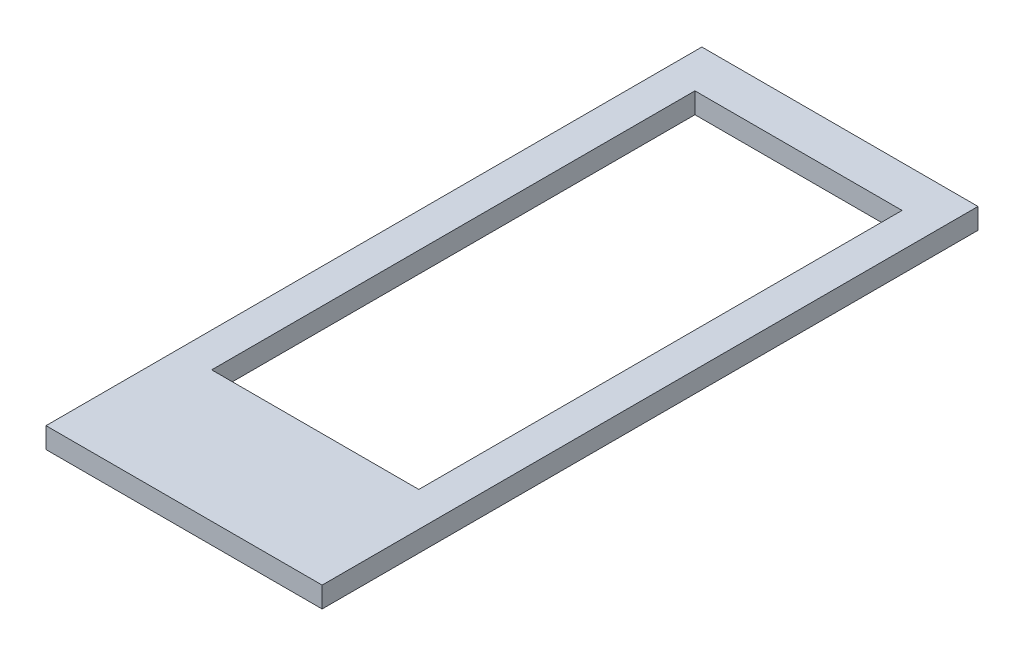
ISO-10303-21;
HEADER;
FILE_DESCRIPTION(('STEP AP214'),'2;1');
FILE_NAME('part.step','',(''),(''),'','','');
FILE_SCHEMA(('AUTOMOTIVE_DESIGN { 1 0 10303 214 1 1 1 1 }'));
ENDSEC;
DATA;
#1=APPLICATION_CONTEXT('core data for automotive mechanical design processes');
#2=APPLICATION_PROTOCOL_DEFINITION('international standard','automotive_design',2000,#1);
#3=PRODUCT_CONTEXT('',#1,'mechanical');
#4=PRODUCT('Part','Part','',(#3));
#5=PRODUCT_RELATED_PRODUCT_CATEGORY('part','',(#4));
#6=PRODUCT_DEFINITION_FORMATION('','',#4);
#7=PRODUCT_DEFINITION_CONTEXT('part definition',#1,'design');
#8=PRODUCT_DEFINITION('design','',#6,#7);
#9=PRODUCT_DEFINITION_SHAPE('','',#8);
#10=(LENGTH_UNIT() NAMED_UNIT(*) SI_UNIT(.MILLI.,.METRE.));
#11=(NAMED_UNIT(*) PLANE_ANGLE_UNIT() SI_UNIT($,.RADIAN.));
#12=(NAMED_UNIT(*) SI_UNIT($,.STERADIAN.) SOLID_ANGLE_UNIT());
#13=UNCERTAINTY_MEASURE_WITH_UNIT(LENGTH_MEASURE(1.E-05),#10,'distance_accuracy_value','');
#14=(GEOMETRIC_REPRESENTATION_CONTEXT(3) GLOBAL_UNCERTAINTY_ASSIGNED_CONTEXT((#13)) GLOBAL_UNIT_ASSIGNED_CONTEXT((#10,
#11,#12)) REPRESENTATION_CONTEXT('',''));
#15=CARTESIAN_POINT('',(0.,0.,0.));
#16=DIRECTION('',(0.,0.,1.));
#17=DIRECTION('',(1.,0.,0.));
#18=AXIS2_PLACEMENT_3D('',#15,#16,#17);
#19=CARTESIAN_POINT('',(0.,3.,0.));
#20=DIRECTION('',(0.,1.,0.));
#21=DIRECTION('',(0.,0.,1.));
#22=AXIS2_PLACEMENT_3D('',#19,#20,#21);
#23=PLANE('',#22);
#24=DIRECTION('',(0.,0.,-1.));
#25=VECTOR('',#24,1.);
#26=CARTESIAN_POINT('',(20.,3.,-47.5));
#27=LINE('',#26,#25);
#28=CARTESIAN_POINT('',(20.,3.,47.5));
#29=VERTEX_POINT('',#28);
#30=CARTESIAN_POINT('',(20.,3.,-47.5));
#31=VERTEX_POINT('',#30);
#32=EDGE_CURVE('E146',#29,#31,#27,.T.);
#33=ORIENTED_EDGE('',*,*,#32,.T.);
#34=DIRECTION('',(-1.,0.,0.));
#35=VECTOR('',#34,1.);
#36=CARTESIAN_POINT('',(-20.,3.,-47.5));
#37=LINE('',#36,#35);
#38=CARTESIAN_POINT('',(-20.,3.,-47.5));
#39=VERTEX_POINT('',#38);
#40=EDGE_CURVE('E149',#31,#39,#37,.T.);
#41=ORIENTED_EDGE('',*,*,#40,.T.);
#42=DIRECTION('',(0.,0.,1.));
#43=VECTOR('',#42,1.);
#44=CARTESIAN_POINT('',(-20.,3.,-47.5));
#45=LINE('',#44,#43);
#46=CARTESIAN_POINT('',(-20.,3.,47.5));
#47=VERTEX_POINT('',#46);
#48=EDGE_CURVE('E152',#39,#47,#45,.T.);
#49=ORIENTED_EDGE('',*,*,#48,.T.);
#50=DIRECTION('',(1.,0.,0.));
#51=VECTOR('',#50,1.);
#52=CARTESIAN_POINT('',(-20.,3.,47.5));
#53=LINE('',#52,#51);
#54=EDGE_CURVE('E154',#47,#29,#53,.T.);
#55=ORIENTED_EDGE('',*,*,#54,.T.);
#56=EDGE_LOOP('',(#33,#41,#49,#55));
#57=FACE_BOUND('',#56,.T.);
#58=DIRECTION('',(1.,0.,0.));
#59=VECTOR('',#58,1.);
#60=CARTESIAN_POINT('',(-15.,3.,28.5));
#61=LINE('',#60,#59);
#62=CARTESIAN_POINT('',(-15.,3.,28.5));
#63=VERTEX_POINT('',#62);
#64=CARTESIAN_POINT('',(15.,3.,28.5));
#65=VERTEX_POINT('',#64);
#66=EDGE_CURVE('E118',#63,#65,#61,.T.);
#67=ORIENTED_EDGE('',*,*,#66,.F.);
#68=DIRECTION('',(0.,0.,1.));
#69=VECTOR('',#68,1.);
#70=CARTESIAN_POINT('',(-15.,3.,-41.5));
#71=LINE('',#70,#69);
#72=CARTESIAN_POINT('',(-15.,3.,-41.5));
#73=VERTEX_POINT('',#72);
#74=EDGE_CURVE('E110',#73,#63,#71,.T.);
#75=ORIENTED_EDGE('',*,*,#74,.F.);
#76=DIRECTION('',(-1.,0.,0.));
#77=VECTOR('',#76,1.);
#78=CARTESIAN_POINT('',(-15.,3.,-41.5));
#79=LINE('',#78,#77);
#80=CARTESIAN_POINT('',(15.,3.,-41.5));
#81=VERTEX_POINT('',#80);
#82=EDGE_CURVE('E132',#81,#73,#79,.T.);
#83=ORIENTED_EDGE('',*,*,#82,.F.);
#84=DIRECTION('',(0.,0.,-1.));
#85=VECTOR('',#84,1.);
#86=CARTESIAN_POINT('',(15.,3.,-41.5));
#87=LINE('',#86,#85);
#88=EDGE_CURVE('E130',#65,#81,#87,.T.);
#89=ORIENTED_EDGE('',*,*,#88,.F.);
#90=EDGE_LOOP('',(#67,#75,#83,#89));
#91=FACE_BOUND('',#90,.T.);
#92=ADVANCED_FACE('F45',(#57,#91),#23,.T.);
#93=CARTESIAN_POINT('',(0.,0.,0.));
#94=DIRECTION('',(0.,1.,0.));
#95=DIRECTION('',(0.,0.,1.));
#96=AXIS2_PLACEMENT_3D('',#93,#94,#95);
#97=PLANE('',#96);
#98=DIRECTION('',(0.,0.,-1.));
#99=VECTOR('',#98,1.);
#100=CARTESIAN_POINT('',(20.,0.,-47.5));
#101=LINE('',#100,#99);
#102=CARTESIAN_POINT('',(20.,0.,47.5));
#103=VERTEX_POINT('',#102);
#104=CARTESIAN_POINT('',(20.,0.,-47.5));
#105=VERTEX_POINT('',#104);
#106=EDGE_CURVE('E126',#103,#105,#101,.T.);
#107=ORIENTED_EDGE('',*,*,#106,.F.);
#108=DIRECTION('',(1.,0.,0.));
#109=VECTOR('',#108,1.);
#110=CARTESIAN_POINT('',(-20.,0.,47.5));
#111=LINE('',#110,#109);
#112=CARTESIAN_POINT('',(-20.,0.,47.5));
#113=VERTEX_POINT('',#112);
#114=EDGE_CURVE('E150',#113,#103,#111,.T.);
#115=ORIENTED_EDGE('',*,*,#114,.F.);
#116=DIRECTION('',(0.,0.,1.));
#117=VECTOR('',#116,1.);
#118=CARTESIAN_POINT('',(-20.,0.,-47.5));
#119=LINE('',#118,#117);
#120=CARTESIAN_POINT('',(-20.,0.,-47.5));
#121=VERTEX_POINT('',#120);
#122=EDGE_CURVE('E161',#121,#113,#119,.T.);
#123=ORIENTED_EDGE('',*,*,#122,.F.);
#124=DIRECTION('',(-1.,0.,0.));
#125=VECTOR('',#124,1.);
#126=CARTESIAN_POINT('',(-20.,0.,-47.5));
#127=LINE('',#126,#125);
#128=EDGE_CURVE('E159',#105,#121,#127,.T.);
#129=ORIENTED_EDGE('',*,*,#128,.F.);
#130=EDGE_LOOP('',(#107,#115,#123,#129));
#131=FACE_BOUND('',#130,.T.);
#132=DIRECTION('',(0.,0.,1.));
#133=VECTOR('',#132,1.);
#134=CARTESIAN_POINT('',(-15.,0.,-41.5));
#135=LINE('',#134,#133);
#136=CARTESIAN_POINT('',(-15.,0.,-41.5));
#137=VERTEX_POINT('',#136);
#138=CARTESIAN_POINT('',(-15.,0.,28.5));
#139=VERTEX_POINT('',#138);
#140=EDGE_CURVE('E68',#137,#139,#135,.T.);
#141=ORIENTED_EDGE('',*,*,#140,.T.);
#142=DIRECTION('',(1.,0.,0.));
#143=VECTOR('',#142,1.);
#144=CARTESIAN_POINT('',(-15.,0.,28.5));
#145=LINE('',#144,#143);
#146=CARTESIAN_POINT('',(15.,0.,28.5));
#147=VERTEX_POINT('',#146);
#148=EDGE_CURVE('E125',#139,#147,#145,.T.);
#149=ORIENTED_EDGE('',*,*,#148,.T.);
#150=DIRECTION('',(0.,0.,-1.));
#151=VECTOR('',#150,1.);
#152=CARTESIAN_POINT('',(15.,0.,-41.5));
#153=LINE('',#152,#151);
#154=CARTESIAN_POINT('',(15.,0.,-41.5));
#155=VERTEX_POINT('',#154);
#156=EDGE_CURVE('E138',#147,#155,#153,.T.);
#157=ORIENTED_EDGE('',*,*,#156,.T.);
#158=DIRECTION('',(-1.,0.,0.));
#159=VECTOR('',#158,1.);
#160=CARTESIAN_POINT('',(-15.,0.,-41.5));
#161=LINE('',#160,#159);
#162=EDGE_CURVE('E119',#155,#137,#161,.T.);
#163=ORIENTED_EDGE('',*,*,#162,.T.);
#164=EDGE_LOOP('',(#141,#149,#157,#163));
#165=FACE_BOUND('',#164,.T.);
#166=ADVANCED_FACE('F179',(#131,#165),#97,.F.);
#167=CARTESIAN_POINT('',(20.,3.,-47.5));
#168=DIRECTION('',(-1.,0.,0.));
#169=DIRECTION('',(0.,0.,1.));
#170=AXIS2_PLACEMENT_3D('',#167,#168,#169);
#171=PLANE('',#170);
#172=ORIENTED_EDGE('',*,*,#106,.T.);
#173=DIRECTION('',(0.,-1.,0.));
#174=VECTOR('',#173,1.);
#175=CARTESIAN_POINT('',(20.,3.,-47.5));
#176=LINE('',#175,#174);
#177=EDGE_CURVE('E11',#31,#105,#176,.T.);
#178=ORIENTED_EDGE('',*,*,#177,.F.);
#179=ORIENTED_EDGE('',*,*,#32,.F.);
#180=DIRECTION('',(0.,-1.,0.));
#181=VECTOR('',#180,1.);
#182=CARTESIAN_POINT('',(20.,3.,47.5));
#183=LINE('',#182,#181);
#184=EDGE_CURVE('E156',#29,#103,#183,.T.);
#185=ORIENTED_EDGE('',*,*,#184,.T.);
#186=EDGE_LOOP('',(#172,#178,#179,#185));
#187=FACE_BOUND('',#186,.T.);
#188=ADVANCED_FACE('F47',(#187),#171,.F.);
#189=CARTESIAN_POINT('',(-20.,3.,-47.5));
#190=DIRECTION('',(0.,0.,1.));
#191=DIRECTION('',(1.,0.,0.));
#192=AXIS2_PLACEMENT_3D('',#189,#190,#191);
#193=PLANE('',#192);
#194=ORIENTED_EDGE('',*,*,#128,.T.);
#195=DIRECTION('',(0.,-1.,0.));
#196=VECTOR('',#195,1.);
#197=CARTESIAN_POINT('',(-20.,3.,-47.5));
#198=LINE('',#197,#196);
#199=EDGE_CURVE('E53',#39,#121,#198,.T.);
#200=ORIENTED_EDGE('',*,*,#199,.F.);
#201=ORIENTED_EDGE('',*,*,#40,.F.);
#202=ORIENTED_EDGE('',*,*,#177,.T.);
#203=EDGE_LOOP('',(#194,#200,#201,#202));
#204=FACE_BOUND('',#203,.T.);
#205=ADVANCED_FACE('F189',(#204),#193,.F.);
#206=CARTESIAN_POINT('',(-20.,3.,-47.5));
#207=DIRECTION('',(1.,0.,0.));
#208=DIRECTION('',(0.,0.,-1.));
#209=AXIS2_PLACEMENT_3D('',#206,#207,#208);
#210=PLANE('',#209);
#211=ORIENTED_EDGE('',*,*,#122,.T.);
#212=DIRECTION('',(0.,-1.,0.));
#213=VECTOR('',#212,1.);
#214=CARTESIAN_POINT('',(-20.,3.,47.5));
#215=LINE('',#214,#213);
#216=EDGE_CURVE('E166',#47,#113,#215,.T.);
#217=ORIENTED_EDGE('',*,*,#216,.F.);
#218=ORIENTED_EDGE('',*,*,#48,.F.);
#219=ORIENTED_EDGE('',*,*,#199,.T.);
#220=EDGE_LOOP('',(#211,#217,#218,#219));
#221=FACE_BOUND('',#220,.T.);
#222=ADVANCED_FACE('F173',(#221),#210,.F.);
#223=CARTESIAN_POINT('',(-20.,3.,47.5));
#224=DIRECTION('',(0.,0.,-1.));
#225=DIRECTION('',(-1.,0.,0.));
#226=AXIS2_PLACEMENT_3D('',#223,#224,#225);
#227=PLANE('',#226);
#228=ORIENTED_EDGE('',*,*,#114,.T.);
#229=ORIENTED_EDGE('',*,*,#184,.F.);
#230=ORIENTED_EDGE('',*,*,#54,.F.);
#231=ORIENTED_EDGE('',*,*,#216,.T.);
#232=EDGE_LOOP('',(#228,#229,#230,#231));
#233=FACE_BOUND('',#232,.T.);
#234=ADVANCED_FACE('F183',(#233),#227,.F.);
#235=CARTESIAN_POINT('',(-15.,3.,-41.5));
#236=DIRECTION('',(1.,0.,0.));
#237=DIRECTION('',(0.,0.,-1.));
#238=AXIS2_PLACEMENT_3D('',#235,#236,#237);
#239=PLANE('',#238);
#240=ORIENTED_EDGE('',*,*,#140,.F.);
#241=DIRECTION('',(0.,-1.,0.));
#242=VECTOR('',#241,1.);
#243=CARTESIAN_POINT('',(-15.,3.,-41.5));
#244=LINE('',#243,#242);
#245=EDGE_CURVE('E114',#73,#137,#244,.T.);
#246=ORIENTED_EDGE('',*,*,#245,.F.);
#247=ORIENTED_EDGE('',*,*,#74,.T.);
#248=DIRECTION('',(0.,-1.,0.));
#249=VECTOR('',#248,1.);
#250=CARTESIAN_POINT('',(-15.,3.,28.5));
#251=LINE('',#250,#249);
#252=EDGE_CURVE('E113',#63,#139,#251,.T.);
#253=ORIENTED_EDGE('',*,*,#252,.T.);
#254=EDGE_LOOP('',(#240,#246,#247,#253));
#255=FACE_BOUND('',#254,.T.);
#256=ADVANCED_FACE('F112',(#255),#239,.T.);
#257=CARTESIAN_POINT('',(-15.,3.,28.5));
#258=DIRECTION('',(0.,0.,-1.));
#259=DIRECTION('',(-1.,0.,0.));
#260=AXIS2_PLACEMENT_3D('',#257,#258,#259);
#261=PLANE('',#260);
#262=ORIENTED_EDGE('',*,*,#148,.F.);
#263=ORIENTED_EDGE('',*,*,#252,.F.);
#264=ORIENTED_EDGE('',*,*,#66,.T.);
#265=DIRECTION('',(0.,-1.,0.));
#266=VECTOR('',#265,1.);
#267=CARTESIAN_POINT('',(15.,3.,28.5));
#268=LINE('',#267,#266);
#269=EDGE_CURVE('E127',#65,#147,#268,.T.);
#270=ORIENTED_EDGE('',*,*,#269,.T.);
#271=EDGE_LOOP('',(#262,#263,#264,#270));
#272=FACE_BOUND('',#271,.T.);
#273=ADVANCED_FACE('F122',(#272),#261,.T.);
#274=CARTESIAN_POINT('',(15.,3.,-41.5));
#275=DIRECTION('',(-1.,0.,0.));
#276=DIRECTION('',(0.,0.,1.));
#277=AXIS2_PLACEMENT_3D('',#274,#275,#276);
#278=PLANE('',#277);
#279=ORIENTED_EDGE('',*,*,#156,.F.);
#280=ORIENTED_EDGE('',*,*,#269,.F.);
#281=ORIENTED_EDGE('',*,*,#88,.T.);
#282=DIRECTION('',(0.,-1.,0.));
#283=VECTOR('',#282,1.);
#284=CARTESIAN_POINT('',(15.,3.,-41.5));
#285=LINE('',#284,#283);
#286=EDGE_CURVE('E60',#81,#155,#285,.T.);
#287=ORIENTED_EDGE('',*,*,#286,.T.);
#288=EDGE_LOOP('',(#279,#280,#281,#287));
#289=FACE_BOUND('',#288,.T.);
#290=ADVANCED_FACE('F213',(#289),#278,.T.);
#291=CARTESIAN_POINT('',(-15.,3.,-41.5));
#292=DIRECTION('',(0.,0.,1.));
#293=DIRECTION('',(1.,0.,0.));
#294=AXIS2_PLACEMENT_3D('',#291,#292,#293);
#295=PLANE('',#294);
#296=ORIENTED_EDGE('',*,*,#162,.F.);
#297=ORIENTED_EDGE('',*,*,#286,.F.);
#298=ORIENTED_EDGE('',*,*,#82,.T.);
#299=ORIENTED_EDGE('',*,*,#245,.T.);
#300=EDGE_LOOP('',(#296,#297,#298,#299));
#301=FACE_BOUND('',#300,.T.);
#302=ADVANCED_FACE('F217',(#301),#295,.T.);
#303=CLOSED_SHELL('',(#92,#166,#188,#205,#222,#234,#256,#273,#290,#302));
#304=MANIFOLD_SOLID_BREP('B2',#303);
#305=ADVANCED_BREP_SHAPE_REPRESENTATION('',(#18,#304),#14);
#306=SHAPE_DEFINITION_REPRESENTATION(#9,#305);
ENDSEC;
END-ISO-10303-21;
